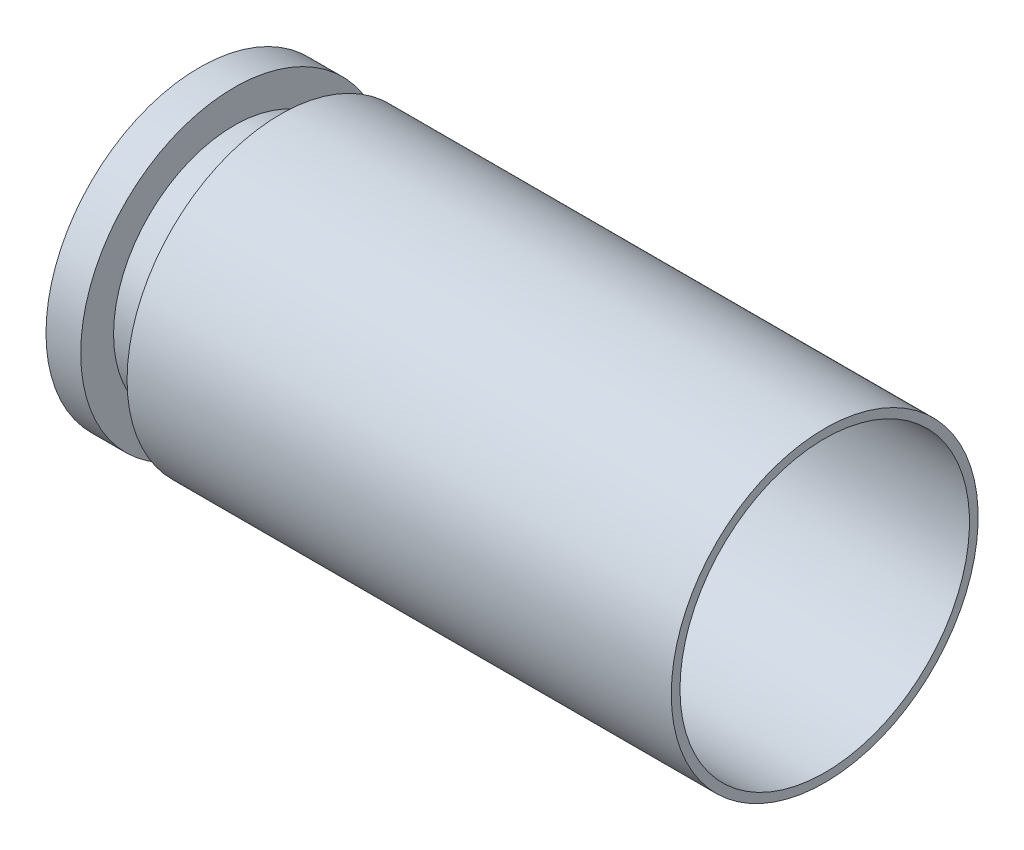
ISO-10303-21;
HEADER;
FILE_DESCRIPTION(('STEP AP214'),'2;1');
FILE_NAME('part.step','',(''),(''),'','','');
FILE_SCHEMA(('AUTOMOTIVE_DESIGN { 1 0 10303 214 1 1 1 1 }'));
ENDSEC;
DATA;
#1=APPLICATION_CONTEXT('core data for automotive mechanical design processes');
#2=APPLICATION_PROTOCOL_DEFINITION('international standard','automotive_design',2000,#1);
#3=PRODUCT_CONTEXT('',#1,'mechanical');
#4=PRODUCT('Part','Part','',(#3));
#5=PRODUCT_RELATED_PRODUCT_CATEGORY('part','',(#4));
#6=PRODUCT_DEFINITION_FORMATION('','',#4);
#7=PRODUCT_DEFINITION_CONTEXT('part definition',#1,'design');
#8=PRODUCT_DEFINITION('design','',#6,#7);
#9=PRODUCT_DEFINITION_SHAPE('','',#8);
#10=(LENGTH_UNIT() NAMED_UNIT(*) SI_UNIT(.MILLI.,.METRE.));
#11=(NAMED_UNIT(*) PLANE_ANGLE_UNIT() SI_UNIT($,.RADIAN.));
#12=(NAMED_UNIT(*) SI_UNIT($,.STERADIAN.) SOLID_ANGLE_UNIT());
#13=UNCERTAINTY_MEASURE_WITH_UNIT(LENGTH_MEASURE(1.E-05),#10,'distance_accuracy_value','');
#14=(GEOMETRIC_REPRESENTATION_CONTEXT(3) GLOBAL_UNCERTAINTY_ASSIGNED_CONTEXT((#13)) GLOBAL_UNIT_ASSIGNED_CONTEXT((#10,
#11,#12)) REPRESENTATION_CONTEXT('',''));
#15=CARTESIAN_POINT('',(0.,0.,0.));
#16=DIRECTION('',(0.,0.,1.));
#17=DIRECTION('',(1.,0.,0.));
#18=AXIS2_PLACEMENT_3D('',#15,#16,#17);
#19=CARTESIAN_POINT('',(0.,0.,0.));
#20=DIRECTION('',(-1.,0.,0.));
#21=DIRECTION('',(0.,0.,1.));
#22=AXIS2_PLACEMENT_3D('',#19,#20,#21);
#23=CYLINDRICAL_SURFACE('',#22,1.);
#24=CARTESIAN_POINT('',(4.2,0.,0.));
#25=DIRECTION('',(-1.,0.,0.));
#26=DIRECTION('',(0.,0.,1.));
#27=AXIS2_PLACEMENT_3D('',#24,#25,#26);
#28=CIRCLE('',#27,1.);
#29=CARTESIAN_POINT('',(4.2,0.,1.));
#30=VERTEX_POINT('',#29);
#31=EDGE_CURVE('E10',#30,#30,#28,.T.);
#32=ORIENTED_EDGE('',*,*,#31,.F.);
#33=EDGE_LOOP('',(#32));
#34=FACE_BOUND('',#33,.T.);
#35=CARTESIAN_POINT('',(3.,0.,0.));
#36=DIRECTION('',(-1.,0.,0.));
#37=DIRECTION('',(0.,0.,1.));
#38=AXIS2_PLACEMENT_3D('',#35,#36,#37);
#39=CIRCLE('',#38,1.);
#40=CARTESIAN_POINT('',(3.,0.,1.));
#41=VERTEX_POINT('',#40);
#42=EDGE_CURVE('E72',#41,#41,#39,.T.);
#43=ORIENTED_EDGE('',*,*,#42,.T.);
#44=EDGE_LOOP('',(#43));
#45=FACE_BOUND('',#44,.T.);
#46=ADVANCED_FACE('F32',(#34,#45),#23,.F.);
#47=CARTESIAN_POINT('',(4.2,1.,0.));
#48=DIRECTION('',(-1.,0.,0.));
#49=DIRECTION('',(0.,0.,1.));
#50=AXIS2_PLACEMENT_3D('',#47,#48,#49);
#51=PLANE('',#50);
#52=CARTESIAN_POINT('',(4.2,0.,0.));
#53=DIRECTION('',(-1.,0.,0.));
#54=DIRECTION('',(0.,0.,1.));
#55=AXIS2_PLACEMENT_3D('',#52,#53,#54);
#56=CIRCLE('',#55,5.);
#57=CARTESIAN_POINT('',(4.2,0.,5.));
#58=VERTEX_POINT('',#57);
#59=EDGE_CURVE('E38',#58,#58,#56,.T.);
#60=ORIENTED_EDGE('',*,*,#59,.F.);
#61=EDGE_LOOP('',(#60));
#62=FACE_BOUND('',#61,.T.);
#63=ORIENTED_EDGE('',*,*,#31,.T.);
#64=EDGE_LOOP('',(#63));
#65=FACE_BOUND('',#64,.T.);
#66=ADVANCED_FACE('F133',(#62,#65),#51,.F.);
#67=CARTESIAN_POINT('',(0.,0.,0.));
#68=DIRECTION('',(-1.,0.,0.));
#69=DIRECTION('',(0.,0.,1.));
#70=AXIS2_PLACEMENT_3D('',#67,#68,#69);
#71=CYLINDRICAL_SURFACE('',#70,5.);
#72=CARTESIAN_POINT('',(21.6,0.,0.));
#73=DIRECTION('',(-1.,0.,0.));
#74=DIRECTION('',(0.,0.,1.));
#75=AXIS2_PLACEMENT_3D('',#72,#73,#74);
#76=CIRCLE('',#75,5.);
#77=CARTESIAN_POINT('',(21.6,0.,5.));
#78=VERTEX_POINT('',#77);
#79=EDGE_CURVE('E42',#78,#78,#76,.T.);
#80=ORIENTED_EDGE('',*,*,#79,.F.);
#81=EDGE_LOOP('',(#80));
#82=FACE_BOUND('',#81,.T.);
#83=ORIENTED_EDGE('',*,*,#59,.T.);
#84=EDGE_LOOP('',(#83));
#85=FACE_BOUND('',#84,.T.);
#86=ADVANCED_FACE('F128',(#82,#85),#71,.F.);
#87=CARTESIAN_POINT('',(21.6,5.3,0.));
#88=DIRECTION('',(-1.,0.,0.));
#89=DIRECTION('',(0.,0.,1.));
#90=AXIS2_PLACEMENT_3D('',#87,#88,#89);
#91=PLANE('',#90);
#92=CARTESIAN_POINT('',(21.6,0.,0.));
#93=DIRECTION('',(-1.,0.,0.));
#94=DIRECTION('',(0.,0.,1.));
#95=AXIS2_PLACEMENT_3D('',#92,#93,#94);
#96=CIRCLE('',#95,5.3);
#97=CARTESIAN_POINT('',(21.6,0.,5.3));
#98=VERTEX_POINT('',#97);
#99=EDGE_CURVE('E46',#98,#98,#96,.T.);
#100=ORIENTED_EDGE('',*,*,#99,.F.);
#101=EDGE_LOOP('',(#100));
#102=FACE_BOUND('',#101,.T.);
#103=ORIENTED_EDGE('',*,*,#79,.T.);
#104=EDGE_LOOP('',(#103));
#105=FACE_BOUND('',#104,.T.);
#106=ADVANCED_FACE('F122',(#102,#105),#91,.F.);
#107=CARTESIAN_POINT('',(0.,0.,0.));
#108=DIRECTION('',(-1.,0.,0.));
#109=DIRECTION('',(0.,0.,1.));
#110=AXIS2_PLACEMENT_3D('',#107,#108,#109);
#111=CYLINDRICAL_SURFACE('',#110,5.3);
#112=CARTESIAN_POINT('',(2.8,0.,0.));
#113=DIRECTION('',(-1.,0.,0.));
#114=DIRECTION('',(0.,0.,1.));
#115=AXIS2_PLACEMENT_3D('',#112,#113,#114);
#116=CIRCLE('',#115,5.3);
#117=CARTESIAN_POINT('',(2.8,0.,5.3));
#118=VERTEX_POINT('',#117);
#119=EDGE_CURVE('E51',#118,#118,#116,.T.);
#120=ORIENTED_EDGE('',*,*,#119,.F.);
#121=EDGE_LOOP('',(#120));
#122=FACE_BOUND('',#121,.T.);
#123=ORIENTED_EDGE('',*,*,#99,.T.);
#124=EDGE_LOOP('',(#123));
#125=FACE_BOUND('',#124,.T.);
#126=ADVANCED_FACE('F116',(#122,#125),#111,.T.);
#127=CARTESIAN_POINT('',(2.8,5.3,0.));
#128=DIRECTION('',(1.,0.,0.));
#129=DIRECTION('',(0.,0.,-1.));
#130=AXIS2_PLACEMENT_3D('',#127,#128,#129);
#131=PLANE('',#130);
#132=CARTESIAN_POINT('',(2.8,0.,0.));
#133=DIRECTION('',(-1.,0.,0.));
#134=DIRECTION('',(0.,0.,1.));
#135=AXIS2_PLACEMENT_3D('',#132,#133,#134);
#136=CIRCLE('',#135,4.1664284938675);
#137=CARTESIAN_POINT('',(2.8,0.,4.1664284938675));
#138=VERTEX_POINT('',#137);
#139=EDGE_CURVE('E54',#138,#138,#136,.T.);
#140=ORIENTED_EDGE('',*,*,#139,.F.);
#141=EDGE_LOOP('',(#140));
#142=FACE_BOUND('',#141,.T.);
#143=ORIENTED_EDGE('',*,*,#119,.T.);
#144=EDGE_LOOP('',(#143));
#145=FACE_BOUND('',#144,.T.);
#146=ADVANCED_FACE('F110',(#142,#145),#131,.F.);
#147=CARTESIAN_POINT('',(0.,0.,0.));
#148=DIRECTION('',(-1.,0.,0.));
#149=DIRECTION('',(0.,0.,1.));
#150=AXIS2_PLACEMENT_3D('',#147,#148,#149);
#151=CYLINDRICAL_SURFACE('',#150,4.1664284938675);
#152=CARTESIAN_POINT('',(1.2,0.,0.));
#153=DIRECTION('',(-1.,0.,0.));
#154=DIRECTION('',(0.,0.,1.));
#155=AXIS2_PLACEMENT_3D('',#152,#153,#154);
#156=CIRCLE('',#155,4.1664284938675);
#157=CARTESIAN_POINT('',(1.2,0.,4.1664284938675));
#158=VERTEX_POINT('',#157);
#159=EDGE_CURVE('E57',#158,#158,#156,.T.);
#160=ORIENTED_EDGE('',*,*,#159,.F.);
#161=EDGE_LOOP('',(#160));
#162=FACE_BOUND('',#161,.T.);
#163=ORIENTED_EDGE('',*,*,#139,.T.);
#164=EDGE_LOOP('',(#163));
#165=FACE_BOUND('',#164,.T.);
#166=ADVANCED_FACE('F104',(#162,#165),#151,.T.);
#167=CARTESIAN_POINT('',(1.2,4.1664284938675,0.));
#168=DIRECTION('',(-1.,0.,0.));
#169=DIRECTION('',(0.,0.,1.));
#170=AXIS2_PLACEMENT_3D('',#167,#168,#169);
#171=PLANE('',#170);
#172=CARTESIAN_POINT('',(1.2,0.,0.));
#173=DIRECTION('',(-1.,0.,0.));
#174=DIRECTION('',(0.,0.,1.));
#175=AXIS2_PLACEMENT_3D('',#172,#173,#174);
#176=CIRCLE('',#175,5.3);
#177=CARTESIAN_POINT('',(1.2,0.,5.3));
#178=VERTEX_POINT('',#177);
#179=EDGE_CURVE('E60',#178,#178,#176,.T.);
#180=ORIENTED_EDGE('',*,*,#179,.F.);
#181=EDGE_LOOP('',(#180));
#182=FACE_BOUND('',#181,.T.);
#183=ORIENTED_EDGE('',*,*,#159,.T.);
#184=EDGE_LOOP('',(#183));
#185=FACE_BOUND('',#184,.T.);
#186=ADVANCED_FACE('F98',(#182,#185),#171,.F.);
#187=CARTESIAN_POINT('',(0.,0.,0.));
#188=DIRECTION('',(-1.,0.,0.));
#189=DIRECTION('',(0.,0.,1.));
#190=AXIS2_PLACEMENT_3D('',#187,#188,#189);
#191=CYLINDRICAL_SURFACE('',#190,5.3);
#192=CARTESIAN_POINT('',(0.,0.,0.));
#193=DIRECTION('',(-1.,0.,0.));
#194=DIRECTION('',(0.,0.,1.));
#195=AXIS2_PLACEMENT_3D('',#192,#193,#194);
#196=CIRCLE('',#195,5.3);
#197=CARTESIAN_POINT('',(0.,0.,5.3));
#198=VERTEX_POINT('',#197);
#199=EDGE_CURVE('E63',#198,#198,#196,.T.);
#200=ORIENTED_EDGE('',*,*,#199,.F.);
#201=EDGE_LOOP('',(#200));
#202=FACE_BOUND('',#201,.T.);
#203=ORIENTED_EDGE('',*,*,#179,.T.);
#204=EDGE_LOOP('',(#203));
#205=FACE_BOUND('',#204,.T.);
#206=ADVANCED_FACE('F92',(#202,#205),#191,.T.);
#207=CARTESIAN_POINT('',(0.,5.3,0.));
#208=DIRECTION('',(1.,0.,0.));
#209=DIRECTION('',(0.,0.,-1.));
#210=AXIS2_PLACEMENT_3D('',#207,#208,#209);
#211=PLANE('',#210);
#212=CARTESIAN_POINT('',(0.,0.,0.));
#213=DIRECTION('',(-1.,0.,0.));
#214=DIRECTION('',(0.,0.,1.));
#215=AXIS2_PLACEMENT_3D('',#212,#213,#214);
#216=CIRCLE('',#215,2.26);
#217=CARTESIAN_POINT('',(0.,0.,2.26));
#218=VERTEX_POINT('',#217);
#219=EDGE_CURVE('E66',#218,#218,#216,.T.);
#220=ORIENTED_EDGE('',*,*,#219,.F.);
#221=EDGE_LOOP('',(#220));
#222=FACE_BOUND('',#221,.T.);
#223=ORIENTED_EDGE('',*,*,#199,.T.);
#224=EDGE_LOOP('',(#223));
#225=FACE_BOUND('',#224,.T.);
#226=ADVANCED_FACE('F86',(#222,#225),#211,.F.);
#227=CARTESIAN_POINT('',(0.,0.,0.));
#228=DIRECTION('',(-1.,0.,0.));
#229=DIRECTION('',(0.,0.,1.));
#230=AXIS2_PLACEMENT_3D('',#227,#228,#229);
#231=CYLINDRICAL_SURFACE('',#230,2.26);
#232=CARTESIAN_POINT('',(3.,0.,0.));
#233=DIRECTION('',(-1.,0.,0.));
#234=DIRECTION('',(0.,0.,1.));
#235=AXIS2_PLACEMENT_3D('',#232,#233,#234);
#236=CIRCLE('',#235,2.26);
#237=CARTESIAN_POINT('',(3.,0.,2.26));
#238=VERTEX_POINT('',#237);
#239=EDGE_CURVE('E69',#238,#238,#236,.T.);
#240=ORIENTED_EDGE('',*,*,#239,.F.);
#241=EDGE_LOOP('',(#240));
#242=FACE_BOUND('',#241,.T.);
#243=ORIENTED_EDGE('',*,*,#219,.T.);
#244=EDGE_LOOP('',(#243));
#245=FACE_BOUND('',#244,.T.);
#246=ADVANCED_FACE('F80',(#242,#245),#231,.F.);
#247=CARTESIAN_POINT('',(3.,2.26,0.));
#248=DIRECTION('',(1.,0.,0.));
#249=DIRECTION('',(0.,0.,-1.));
#250=AXIS2_PLACEMENT_3D('',#247,#248,#249);
#251=PLANE('',#250);
#252=ORIENTED_EDGE('',*,*,#42,.F.);
#253=EDGE_LOOP('',(#252));
#254=FACE_BOUND('',#253,.T.);
#255=ORIENTED_EDGE('',*,*,#239,.T.);
#256=EDGE_LOOP('',(#255));
#257=FACE_BOUND('',#256,.T.);
#258=ADVANCED_FACE('F77',(#254,#257),#251,.F.);
#259=CLOSED_SHELL('',(#46,#66,#86,#106,#126,#146,#166,#186,#206,#226,#246,#258));
#260=MANIFOLD_SOLID_BREP('B2',#259);
#261=ADVANCED_BREP_SHAPE_REPRESENTATION('',(#18,#260),#14);
#262=SHAPE_DEFINITION_REPRESENTATION(#9,#261);
ENDSEC;
END-ISO-10303-21;
